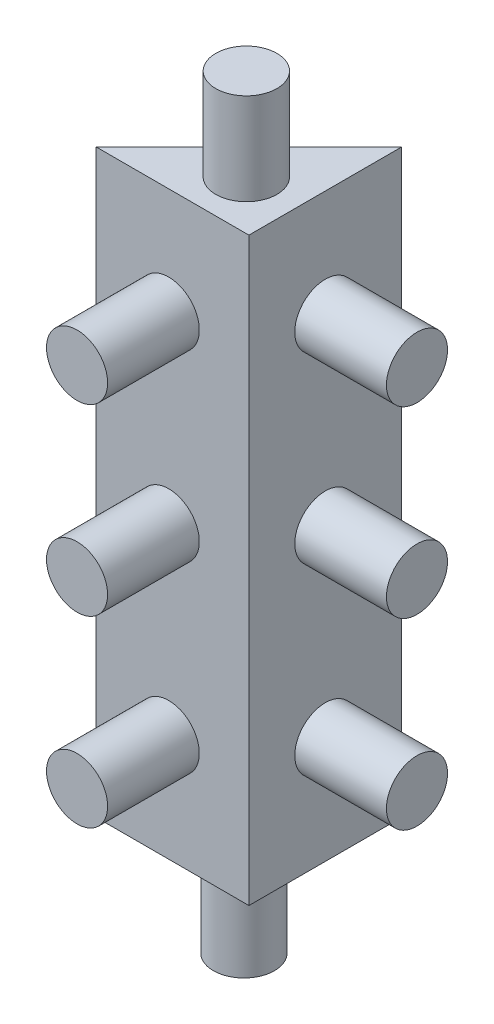
ISO-10303-21;
HEADER;
FILE_DESCRIPTION(('STEP AP214'),'2;1');
FILE_NAME('part.step','',(''),(''),'','','');
FILE_SCHEMA(('AUTOMOTIVE_DESIGN { 1 0 10303 214 1 1 1 1 }'));
ENDSEC;
DATA;
#1=APPLICATION_CONTEXT('core data for automotive mechanical design processes');
#2=APPLICATION_PROTOCOL_DEFINITION('international standard','automotive_design',2000,#1);
#3=PRODUCT_CONTEXT('',#1,'mechanical');
#4=PRODUCT('Part','Part','',(#3));
#5=PRODUCT_RELATED_PRODUCT_CATEGORY('part','',(#4));
#6=PRODUCT_DEFINITION_FORMATION('','',#4);
#7=PRODUCT_DEFINITION_CONTEXT('part definition',#1,'design');
#8=PRODUCT_DEFINITION('design','',#6,#7);
#9=PRODUCT_DEFINITION_SHAPE('','',#8);
#10=(LENGTH_UNIT() NAMED_UNIT(*) SI_UNIT(.MILLI.,.METRE.));
#11=(NAMED_UNIT(*) PLANE_ANGLE_UNIT() SI_UNIT($,.RADIAN.));
#12=(NAMED_UNIT(*) SI_UNIT($,.STERADIAN.) SOLID_ANGLE_UNIT());
#13=UNCERTAINTY_MEASURE_WITH_UNIT(LENGTH_MEASURE(1.E-05),#10,'distance_accuracy_value','');
#14=(GEOMETRIC_REPRESENTATION_CONTEXT(3) GLOBAL_UNCERTAINTY_ASSIGNED_CONTEXT((#13)) GLOBAL_UNIT_ASSIGNED_CONTEXT((#10,
#11,#12)) REPRESENTATION_CONTEXT('',''));
#15=CARTESIAN_POINT('',(0.,0.,0.));
#16=DIRECTION('',(0.,0.,1.));
#17=DIRECTION('',(1.,0.,0.));
#18=AXIS2_PLACEMENT_3D('',#15,#16,#17);
#19=CARTESIAN_POINT('',(6.66438695565709,48.26,-6.66438695565709));
#20=DIRECTION('',(-1.,0.,0.));
#21=DIRECTION('',(0.,0.,1.));
#22=AXIS2_PLACEMENT_3D('',#19,#20,#21);
#23=PLANE('',#22);
#24=CARTESIAN_POINT('',(6.66438695565709,39.37,-0.314386955657094));
#25=DIRECTION('',(-1.,0.,0.));
#26=DIRECTION('',(0.,0.,1.));
#27=AXIS2_PLACEMENT_3D('',#24,#25,#26);
#28=CIRCLE('',#27,2.54);
#29=CARTESIAN_POINT('',(6.66438695565709,39.37,2.22561304434291));
#30=VERTEX_POINT('',#29);
#31=EDGE_CURVE('E40',#30,#30,#28,.F.);
#32=ORIENTED_EDGE('',*,*,#31,.F.);
#33=EDGE_LOOP('',(#32));
#34=FACE_BOUND('',#33,.T.);
#35=CARTESIAN_POINT('',(6.66438695565709,24.13,-0.314386955657094));
#36=DIRECTION('',(-1.,0.,0.));
#37=DIRECTION('',(0.,0.,1.));
#38=AXIS2_PLACEMENT_3D('',#35,#36,#37);
#39=CIRCLE('',#38,2.54);
#40=CARTESIAN_POINT('',(6.66438695565709,24.13,2.22561304434291));
#41=VERTEX_POINT('',#40);
#42=EDGE_CURVE('E100',#41,#41,#39,.F.);
#43=ORIENTED_EDGE('',*,*,#42,.F.);
#44=EDGE_LOOP('',(#43));
#45=FACE_BOUND('',#44,.T.);
#46=CARTESIAN_POINT('',(6.66438695565709,8.89,-0.314386955657094));
#47=DIRECTION('',(-1.,0.,0.));
#48=DIRECTION('',(0.,0.,1.));
#49=AXIS2_PLACEMENT_3D('',#46,#47,#48);
#50=CIRCLE('',#49,2.54);
#51=CARTESIAN_POINT('',(6.66438695565709,8.89,2.22561304434291));
#52=VERTEX_POINT('',#51);
#53=EDGE_CURVE('E97',#52,#52,#50,.F.);
#54=ORIENTED_EDGE('',*,*,#53,.F.);
#55=EDGE_LOOP('',(#54));
#56=FACE_BOUND('',#55,.T.);
#57=DIRECTION('',(0.,0.,-1.));
#58=VECTOR('',#57,1.);
#59=CARTESIAN_POINT('',(6.66438695565709,0.,-6.66438695565709));
#60=LINE('',#59,#58);
#61=CARTESIAN_POINT('',(6.66438695565709,0.,6.03561304434291));
#62=VERTEX_POINT('',#61);
#63=CARTESIAN_POINT('',(6.66438695565709,0.,-6.66438695565709));
#64=VERTEX_POINT('',#63);
#65=EDGE_CURVE('E82',#62,#64,#60,.T.);
#66=ORIENTED_EDGE('',*,*,#65,.T.);
#67=DIRECTION('',(0.,-1.,0.));
#68=VECTOR('',#67,1.);
#69=CARTESIAN_POINT('',(6.66438695565709,48.26,-6.66438695565709));
#70=LINE('',#69,#68);
#71=CARTESIAN_POINT('',(6.66438695565709,48.26,-6.66438695565709));
#72=VERTEX_POINT('',#71);
#73=EDGE_CURVE('E72',#72,#64,#70,.T.);
#74=ORIENTED_EDGE('',*,*,#73,.F.);
#75=DIRECTION('',(0.,0.,-1.));
#76=VECTOR('',#75,1.);
#77=CARTESIAN_POINT('',(6.66438695565709,48.26,-6.66438695565709));
#78=LINE('',#77,#76);
#79=CARTESIAN_POINT('',(6.66438695565709,48.26,6.03561304434291));
#80=VERTEX_POINT('',#79);
#81=EDGE_CURVE('E75',#80,#72,#78,.T.);
#82=ORIENTED_EDGE('',*,*,#81,.F.);
#83=DIRECTION('',(0.,-1.,0.));
#84=VECTOR('',#83,1.);
#85=CARTESIAN_POINT('',(6.66438695565709,48.26,6.03561304434291));
#86=LINE('',#85,#84);
#87=EDGE_CURVE('E88',#80,#62,#86,.T.);
#88=ORIENTED_EDGE('',*,*,#87,.T.);
#89=EDGE_LOOP('',(#66,#74,#82,#88));
#90=FACE_BOUND('',#89,.T.);
#91=ADVANCED_FACE('F32',(#34,#45,#56,#90),#23,.F.);
#92=CARTESIAN_POINT('',(-6.03561304434291,48.26,6.03561304434291));
#93=DIRECTION('',(0.707106781186548,0.,0.707106781186547));
#94=DIRECTION('',(0.707106781186547,0.,-0.707106781186548));
#95=AXIS2_PLACEMENT_3D('',#92,#93,#94);
#96=PLANE('',#95);
#97=DIRECTION('',(-0.707106781186547,0.,0.707106781186548));
#98=VECTOR('',#97,1.);
#99=CARTESIAN_POINT('',(-6.03561304434291,0.,6.03561304434291));
#100=LINE('',#99,#98);
#101=CARTESIAN_POINT('',(-6.03561304434291,0.,6.03561304434291));
#102=VERTEX_POINT('',#101);
#103=EDGE_CURVE('E61',#64,#102,#100,.T.);
#104=ORIENTED_EDGE('',*,*,#103,.T.);
#105=DIRECTION('',(0.,-1.,0.));
#106=VECTOR('',#105,1.);
#107=CARTESIAN_POINT('',(-6.03561304434291,48.26,6.03561304434291));
#108=LINE('',#107,#106);
#109=CARTESIAN_POINT('',(-6.03561304434291,48.26,6.03561304434291));
#110=VERTEX_POINT('',#109);
#111=EDGE_CURVE('E74',#110,#102,#108,.T.);
#112=ORIENTED_EDGE('',*,*,#111,.F.);
#113=DIRECTION('',(-0.707106781186547,0.,0.707106781186548));
#114=VECTOR('',#113,1.);
#115=CARTESIAN_POINT('',(-6.03561304434291,48.26,6.03561304434291));
#116=LINE('',#115,#114);
#117=EDGE_CURVE('E69',#72,#110,#116,.T.);
#118=ORIENTED_EDGE('',*,*,#117,.F.);
#119=ORIENTED_EDGE('',*,*,#73,.T.);
#120=EDGE_LOOP('',(#104,#112,#118,#119));
#121=FACE_BOUND('',#120,.T.);
#122=ADVANCED_FACE('F70',(#121),#96,.F.);
#123=CARTESIAN_POINT('',(-6.03561304434291,48.26,6.03561304434291));
#124=DIRECTION('',(0.,0.,-1.));
#125=DIRECTION('',(-1.,0.,0.));
#126=AXIS2_PLACEMENT_3D('',#123,#124,#125);
#127=PLANE('',#126);
#128=CARTESIAN_POINT('',(0.,39.37,6.03561304434291));
#129=DIRECTION('',(0.,0.,-1.));
#130=DIRECTION('',(-1.,0.,0.));
#131=AXIS2_PLACEMENT_3D('',#128,#129,#130);
#132=CIRCLE('',#131,2.54);
#133=CARTESIAN_POINT('',(-2.54,39.37,6.03561304434291));
#134=VERTEX_POINT('',#133);
#135=EDGE_CURVE('E94',#134,#134,#132,.F.);
#136=ORIENTED_EDGE('',*,*,#135,.F.);
#137=EDGE_LOOP('',(#136));
#138=FACE_BOUND('',#137,.T.);
#139=CARTESIAN_POINT('',(0.,24.13,6.03561304434291));
#140=DIRECTION('',(0.,0.,-1.));
#141=DIRECTION('',(-1.,0.,0.));
#142=AXIS2_PLACEMENT_3D('',#139,#140,#141);
#143=CIRCLE('',#142,2.54);
#144=CARTESIAN_POINT('',(-2.54,24.13,6.03561304434291));
#145=VERTEX_POINT('',#144);
#146=EDGE_CURVE('E86',#145,#145,#143,.F.);
#147=ORIENTED_EDGE('',*,*,#146,.F.);
#148=EDGE_LOOP('',(#147));
#149=FACE_BOUND('',#148,.T.);
#150=CARTESIAN_POINT('',(0.,8.89,6.03561304434291));
#151=DIRECTION('',(0.,0.,-1.));
#152=DIRECTION('',(-1.,0.,0.));
#153=AXIS2_PLACEMENT_3D('',#150,#151,#152);
#154=CIRCLE('',#153,2.54);
#155=CARTESIAN_POINT('',(-2.54,8.89,6.03561304434291));
#156=VERTEX_POINT('',#155);
#157=EDGE_CURVE('E83',#156,#156,#154,.F.);
#158=ORIENTED_EDGE('',*,*,#157,.F.);
#159=EDGE_LOOP('',(#158));
#160=FACE_BOUND('',#159,.T.);
#161=DIRECTION('',(1.,0.,0.));
#162=VECTOR('',#161,1.);
#163=CARTESIAN_POINT('',(-6.03561304434291,0.,6.03561304434291));
#164=LINE('',#163,#162);
#165=EDGE_CURVE('E66',#102,#62,#164,.T.);
#166=ORIENTED_EDGE('',*,*,#165,.T.);
#167=ORIENTED_EDGE('',*,*,#87,.F.);
#168=DIRECTION('',(1.,0.,0.));
#169=VECTOR('',#168,1.);
#170=CARTESIAN_POINT('',(-6.03561304434291,48.26,6.03561304434291));
#171=LINE('',#170,#169);
#172=EDGE_CURVE('E48',#110,#80,#171,.T.);
#173=ORIENTED_EDGE('',*,*,#172,.F.);
#174=ORIENTED_EDGE('',*,*,#111,.T.);
#175=EDGE_LOOP('',(#166,#167,#173,#174));
#176=FACE_BOUND('',#175,.T.);
#177=ADVANCED_FACE('F154',(#138,#149,#160,#176),#127,.F.);
#178=CARTESIAN_POINT('',(0.,48.26,0.));
#179=DIRECTION('',(0.,1.,0.));
#180=DIRECTION('',(0.,0.,1.));
#181=AXIS2_PLACEMENT_3D('',#178,#179,#180);
#182=PLANE('',#181);
#183=CARTESIAN_POINT('',(2.36043583447517,48.26,1.94481378475693));
#184=DIRECTION('',(0.,1.,0.));
#185=DIRECTION('',(0.,0.,1.));
#186=AXIS2_PLACEMENT_3D('',#183,#184,#185);
#187=CIRCLE('',#186,2.54);
#188=CARTESIAN_POINT('',(2.36043583447517,48.26,4.48481378475693));
#189=VERTEX_POINT('',#188);
#190=EDGE_CURVE('E301',#189,#189,#187,.T.);
#191=ORIENTED_EDGE('',*,*,#190,.F.);
#192=EDGE_LOOP('',(#191));
#193=FACE_BOUND('',#192,.T.);
#194=ORIENTED_EDGE('',*,*,#81,.T.);
#195=ORIENTED_EDGE('',*,*,#117,.T.);
#196=ORIENTED_EDGE('',*,*,#172,.T.);
#197=EDGE_LOOP('',(#194,#195,#196));
#198=FACE_BOUND('',#197,.T.);
#199=ADVANCED_FACE('F78',(#193,#198),#182,.T.);
#200=CARTESIAN_POINT('',(0.,0.,0.));
#201=DIRECTION('',(0.,1.,0.));
#202=DIRECTION('',(0.,0.,1.));
#203=AXIS2_PLACEMENT_3D('',#200,#201,#202);
#204=PLANE('',#203);
#205=CARTESIAN_POINT('',(2.25920074041402,0.,2.04604887881808));
#206=DIRECTION('',(0.,1.,0.));
#207=DIRECTION('',(0.,0.,1.));
#208=AXIS2_PLACEMENT_3D('',#205,#206,#207);
#209=CIRCLE('',#208,2.54);
#210=CARTESIAN_POINT('',(2.25920074041402,0.,4.58604887881808));
#211=VERTEX_POINT('',#210);
#212=EDGE_CURVE('E11',#211,#211,#209,.F.);
#213=ORIENTED_EDGE('',*,*,#212,.F.);
#214=EDGE_LOOP('',(#213));
#215=FACE_BOUND('',#214,.T.);
#216=ORIENTED_EDGE('',*,*,#65,.F.);
#217=ORIENTED_EDGE('',*,*,#165,.F.);
#218=ORIENTED_EDGE('',*,*,#103,.F.);
#219=EDGE_LOOP('',(#216,#217,#218));
#220=FACE_BOUND('',#219,.T.);
#221=ADVANCED_FACE('F150',(#215,#220),#204,.F.);
#222=CARTESIAN_POINT('',(0.,8.89,13.6556130443429));
#223=DIRECTION('',(0.,0.,-1.));
#224=DIRECTION('',(-1.,0.,0.));
#225=AXIS2_PLACEMENT_3D('',#222,#223,#224);
#226=CYLINDRICAL_SURFACE('',#225,2.54);
#227=CARTESIAN_POINT('',(0.,8.89,13.6556130443429));
#228=DIRECTION('',(0.,0.,1.));
#229=DIRECTION('',(1.,0.,0.));
#230=AXIS2_PLACEMENT_3D('',#227,#228,#229);
#231=CIRCLE('',#230,2.54);
#232=CARTESIAN_POINT('',(-2.54,8.89,13.6556130443429));
#233=VERTEX_POINT('',#232);
#234=EDGE_CURVE('E323',#233,#233,#231,.T.);
#235=CARTESIAN_POINT('',(-2.54,8.89,13.6556130443429));
#236=CARTESIAN_POINT('',(-2.54,8.89,13.5762380443429));
#237=CARTESIAN_POINT('',(-2.54,8.89,13.4968630443429));
#238=CARTESIAN_POINT('',(-2.54,8.89,13.3381130443429));
#239=CARTESIAN_POINT('',(-2.54,8.89,13.2587380443429));
#240=CARTESIAN_POINT('',(-2.54,8.89,13.0999880443429));
#241=CARTESIAN_POINT('',(-2.54,8.89,13.0206130443429));
#242=CARTESIAN_POINT('',(-2.54,8.89,12.8618630443429));
#243=CARTESIAN_POINT('',(-2.54,8.89,12.7824880443429));
#244=CARTESIAN_POINT('',(-2.54,8.89,12.6237380443429));
#245=CARTESIAN_POINT('',(-2.54,8.89,12.5443630443429));
#246=CARTESIAN_POINT('',(-2.54,8.89,12.3856130443429));
#247=CARTESIAN_POINT('',(-2.54,8.89,12.3062380443429));
#248=CARTESIAN_POINT('',(-2.54,8.89,12.1474880443429));
#249=CARTESIAN_POINT('',(-2.54,8.89,12.0681130443429));
#250=CARTESIAN_POINT('',(-2.54,8.89,11.9093630443429));
#251=CARTESIAN_POINT('',(-2.54,8.89,11.8299880443429));
#252=CARTESIAN_POINT('',(-2.54,8.89,11.6712380443429));
#253=CARTESIAN_POINT('',(-2.54,8.89,11.5918630443429));
#254=CARTESIAN_POINT('',(-2.54,8.89,11.4331130443429));
#255=CARTESIAN_POINT('',(-2.54,8.89,11.3537380443429));
#256=CARTESIAN_POINT('',(-2.54,8.89,11.1949880443429));
#257=CARTESIAN_POINT('',(-2.54,8.89,11.1156130443429));
#258=CARTESIAN_POINT('',(-2.54,8.89,10.9568630443429));
#259=CARTESIAN_POINT('',(-2.54,8.89,10.8774880443429));
#260=CARTESIAN_POINT('',(-2.54,8.89,10.7187380443429));
#261=CARTESIAN_POINT('',(-2.54,8.89,10.6393630443429));
#262=CARTESIAN_POINT('',(-2.54,8.89,10.4806130443429));
#263=CARTESIAN_POINT('',(-2.54,8.89,10.4012380443429));
#264=CARTESIAN_POINT('',(-2.54,8.89,10.2424880443429));
#265=CARTESIAN_POINT('',(-2.54,8.89,10.1631130443429));
#266=CARTESIAN_POINT('',(-2.54,8.89,10.0043630443429));
#267=CARTESIAN_POINT('',(-2.54,8.89,9.9249880443429));
#268=CARTESIAN_POINT('',(-2.54,8.89,9.7662380443429));
#269=CARTESIAN_POINT('',(-2.54,8.89,9.68686304434291));
#270=CARTESIAN_POINT('',(-2.54,8.89,9.52811304434291));
#271=CARTESIAN_POINT('',(-2.54,8.89,9.44873804434291));
#272=CARTESIAN_POINT('',(-2.54,8.89,9.28998804434291));
#273=CARTESIAN_POINT('',(-2.54,8.89,9.2106130443429));
#274=CARTESIAN_POINT('',(-2.54,8.89,9.05186304434291));
#275=CARTESIAN_POINT('',(-2.54,8.89,8.9724880443429));
#276=CARTESIAN_POINT('',(-2.54,8.89,8.81373804434291));
#277=CARTESIAN_POINT('',(-2.54,8.89,8.7343630443429));
#278=CARTESIAN_POINT('',(-2.54,8.89,8.57561304434291));
#279=CARTESIAN_POINT('',(-2.54,8.89,8.4962380443429));
#280=CARTESIAN_POINT('',(-2.54,8.89,8.3374880443429));
#281=CARTESIAN_POINT('',(-2.54,8.89,8.25811304434291));
#282=CARTESIAN_POINT('',(-2.54,8.89,8.09936304434291));
#283=CARTESIAN_POINT('',(-2.54,8.89,8.0199880443429));
#284=CARTESIAN_POINT('',(-2.54,8.89,7.86123804434291));
#285=CARTESIAN_POINT('',(-2.54,8.89,7.7818630443429));
#286=CARTESIAN_POINT('',(-2.54,8.89,7.62311304434291));
#287=CARTESIAN_POINT('',(-2.54,8.89,7.54373804434291));
#288=CARTESIAN_POINT('',(-2.54,8.89,7.38498804434291));
#289=CARTESIAN_POINT('',(-2.54,8.89,7.30561304434291));
#290=CARTESIAN_POINT('',(-2.54,8.89,7.14686304434291));
#291=CARTESIAN_POINT('',(-2.54,8.89,7.06748804434291));
#292=CARTESIAN_POINT('',(-2.54,8.89,6.90873804434291));
#293=CARTESIAN_POINT('',(-2.54,8.89,6.82936304434291));
#294=CARTESIAN_POINT('',(-2.54,8.89,6.67061304434291));
#295=CARTESIAN_POINT('',(-2.54,8.89,6.59123804434291));
#296=CARTESIAN_POINT('',(-2.54,8.89,6.43248804434291));
#297=CARTESIAN_POINT('',(-2.54,8.89,6.35311304434291));
#298=CARTESIAN_POINT('',(-2.54,8.89,6.19436304434291));
#299=CARTESIAN_POINT('',(-2.54,8.89,6.11498804434291));
#300=CARTESIAN_POINT('',(-2.54,8.89,6.03561304434291));
#301=B_SPLINE_CURVE_WITH_KNOTS('',3,(#235,#236,#237,#238,#239,#240,#241,#242,#243,#244,#245,
#246,#247,#248,#249,#250,#251,#252,#253,#254,#255,#256,#257,#258,#259,#260,#261,#262,#263,#264,
#265,#266,#267,#268,#269,#270,#271,#272,#273,#274,#275,#276,#277,#278,#279,#280,#281,#282,#283,
#284,#285,#286,#287,#288,#289,#290,#291,#292,#293,#294,#295,#296,#297,#298,#299,#300),
.UNSPECIFIED.,.F.,.F.,(4,2,2,2,2,2,2,2,2,2,2,2,2,2,2,2,2,2,2,2,2,2,2,2,2,2,2,2,2,2,2,2,4),(0.,
0.238125,0.476250000000001,0.714375000000001,0.9525,1.190625,1.42875,1.666875,1.905,2.143125,
2.38125,2.619375,2.8575,3.095625,3.33375,3.571875,3.81,4.048125,4.28625,4.524375,4.7625,
5.000625,5.23875,5.476875,5.715,5.953125,6.19125,6.429375,6.6675,6.905625,7.14375,7.381875,
7.62),.UNSPECIFIED.);
#302=EDGE_CURVE('BSEAM146',#233,#156,#301,.T.);
#303=ORIENTED_EDGE('',*,*,#234,.F.);
#304=ORIENTED_EDGE('',*,*,#157,.T.);
#305=ORIENTED_EDGE('',*,*,#302,.T.);
#306=ORIENTED_EDGE('',*,*,#302,.F.);
#307=EDGE_LOOP('',(#303,#305,#304,#306));
#308=FACE_BOUND('',#307,.T.);
#309=ADVANCED_FACE('F146',(#308),#226,.T.);
#310=CARTESIAN_POINT('',(0.,8.89,13.6556130443429));
#311=DIRECTION('',(0.,0.,1.));
#312=DIRECTION('',(1.,0.,0.));
#313=AXIS2_PLACEMENT_3D('',#310,#311,#312);
#314=PLANE('',#313);
#315=ORIENTED_EDGE('',*,*,#234,.T.);
#316=EDGE_LOOP('',(#315));
#317=FACE_BOUND('',#316,.T.);
#318=ADVANCED_FACE('F142',(#317),#314,.T.);
#319=CARTESIAN_POINT('',(0.,24.13,13.6556130443429));
#320=DIRECTION('',(0.,0.,-1.));
#321=DIRECTION('',(-1.,0.,0.));
#322=AXIS2_PLACEMENT_3D('',#319,#320,#321);
#323=CYLINDRICAL_SURFACE('',#322,2.54);
#324=CARTESIAN_POINT('',(0.,24.13,13.6556130443429));
#325=DIRECTION('',(0.,0.,1.));
#326=DIRECTION('',(1.,0.,0.));
#327=AXIS2_PLACEMENT_3D('',#324,#325,#326);
#328=CIRCLE('',#327,2.54);
#329=CARTESIAN_POINT('',(-2.54,24.13,13.6556130443429));
#330=VERTEX_POINT('',#329);
#331=EDGE_CURVE('E320',#330,#330,#328,.T.);
#332=CARTESIAN_POINT('',(-2.54,24.13,13.6556130443429));
#333=CARTESIAN_POINT('',(-2.54,24.13,13.5762380443429));
#334=CARTESIAN_POINT('',(-2.54,24.13,13.4968630443429));
#335=CARTESIAN_POINT('',(-2.54,24.13,13.3381130443429));
#336=CARTESIAN_POINT('',(-2.54,24.13,13.2587380443429));
#337=CARTESIAN_POINT('',(-2.54,24.13,13.0999880443429));
#338=CARTESIAN_POINT('',(-2.54,24.13,13.0206130443429));
#339=CARTESIAN_POINT('',(-2.54,24.13,12.8618630443429));
#340=CARTESIAN_POINT('',(-2.54,24.13,12.7824880443429));
#341=CARTESIAN_POINT('',(-2.54,24.13,12.6237380443429));
#342=CARTESIAN_POINT('',(-2.54,24.13,12.5443630443429));
#343=CARTESIAN_POINT('',(-2.54,24.13,12.3856130443429));
#344=CARTESIAN_POINT('',(-2.54,24.13,12.3062380443429));
#345=CARTESIAN_POINT('',(-2.54,24.13,12.1474880443429));
#346=CARTESIAN_POINT('',(-2.54,24.13,12.0681130443429));
#347=CARTESIAN_POINT('',(-2.54,24.13,11.9093630443429));
#348=CARTESIAN_POINT('',(-2.54,24.13,11.8299880443429));
#349=CARTESIAN_POINT('',(-2.54,24.13,11.6712380443429));
#350=CARTESIAN_POINT('',(-2.54,24.13,11.5918630443429));
#351=CARTESIAN_POINT('',(-2.54,24.13,11.4331130443429));
#352=CARTESIAN_POINT('',(-2.54,24.13,11.3537380443429));
#353=CARTESIAN_POINT('',(-2.54,24.13,11.1949880443429));
#354=CARTESIAN_POINT('',(-2.54,24.13,11.1156130443429));
#355=CARTESIAN_POINT('',(-2.54,24.13,10.9568630443429));
#356=CARTESIAN_POINT('',(-2.54,24.13,10.8774880443429));
#357=CARTESIAN_POINT('',(-2.54,24.13,10.7187380443429));
#358=CARTESIAN_POINT('',(-2.54,24.13,10.6393630443429));
#359=CARTESIAN_POINT('',(-2.54,24.13,10.4806130443429));
#360=CARTESIAN_POINT('',(-2.54,24.13,10.4012380443429));
#361=CARTESIAN_POINT('',(-2.54,24.13,10.2424880443429));
#362=CARTESIAN_POINT('',(-2.54,24.13,10.1631130443429));
#363=CARTESIAN_POINT('',(-2.54,24.13,10.0043630443429));
#364=CARTESIAN_POINT('',(-2.54,24.13,9.9249880443429));
#365=CARTESIAN_POINT('',(-2.54,24.13,9.7662380443429));
#366=CARTESIAN_POINT('',(-2.54,24.13,9.68686304434291));
#367=CARTESIAN_POINT('',(-2.54,24.13,9.52811304434291));
#368=CARTESIAN_POINT('',(-2.54,24.13,9.44873804434291));
#369=CARTESIAN_POINT('',(-2.54,24.13,9.28998804434291));
#370=CARTESIAN_POINT('',(-2.54,24.13,9.2106130443429));
#371=CARTESIAN_POINT('',(-2.54,24.13,9.05186304434291));
#372=CARTESIAN_POINT('',(-2.54,24.13,8.9724880443429));
#373=CARTESIAN_POINT('',(-2.54,24.13,8.81373804434291));
#374=CARTESIAN_POINT('',(-2.54,24.13,8.7343630443429));
#375=CARTESIAN_POINT('',(-2.54,24.13,8.57561304434291));
#376=CARTESIAN_POINT('',(-2.54,24.13,8.4962380443429));
#377=CARTESIAN_POINT('',(-2.54,24.13,8.3374880443429));
#378=CARTESIAN_POINT('',(-2.54,24.13,8.25811304434291));
#379=CARTESIAN_POINT('',(-2.54,24.13,8.09936304434291));
#380=CARTESIAN_POINT('',(-2.54,24.13,8.0199880443429));
#381=CARTESIAN_POINT('',(-2.54,24.13,7.86123804434291));
#382=CARTESIAN_POINT('',(-2.54,24.13,7.7818630443429));
#383=CARTESIAN_POINT('',(-2.54,24.13,7.62311304434291));
#384=CARTESIAN_POINT('',(-2.54,24.13,7.54373804434291));
#385=CARTESIAN_POINT('',(-2.54,24.13,7.38498804434291));
#386=CARTESIAN_POINT('',(-2.54,24.13,7.30561304434291));
#387=CARTESIAN_POINT('',(-2.54,24.13,7.14686304434291));
#388=CARTESIAN_POINT('',(-2.54,24.13,7.06748804434291));
#389=CARTESIAN_POINT('',(-2.54,24.13,6.90873804434291));
#390=CARTESIAN_POINT('',(-2.54,24.13,6.82936304434291));
#391=CARTESIAN_POINT('',(-2.54,24.13,6.67061304434291));
#392=CARTESIAN_POINT('',(-2.54,24.13,6.59123804434291));
#393=CARTESIAN_POINT('',(-2.54,24.13,6.43248804434291));
#394=CARTESIAN_POINT('',(-2.54,24.13,6.35311304434291));
#395=CARTESIAN_POINT('',(-2.54,24.13,6.19436304434291));
#396=CARTESIAN_POINT('',(-2.54,24.13,6.11498804434291));
#397=CARTESIAN_POINT('',(-2.54,24.13,6.03561304434291));
#398=B_SPLINE_CURVE_WITH_KNOTS('',3,(#332,#333,#334,#335,#336,#337,#338,#339,#340,#341,#342,
#343,#344,#345,#346,#347,#348,#349,#350,#351,#352,#353,#354,#355,#356,#357,#358,#359,#360,#361,
#362,#363,#364,#365,#366,#367,#368,#369,#370,#371,#372,#373,#374,#375,#376,#377,#378,#379,#380,
#381,#382,#383,#384,#385,#386,#387,#388,#389,#390,#391,#392,#393,#394,#395,#396,#397),
.UNSPECIFIED.,.F.,.F.,(4,2,2,2,2,2,2,2,2,2,2,2,2,2,2,2,2,2,2,2,2,2,2,2,2,2,2,2,2,2,2,2,4),(0.,
0.238125,0.476250000000001,0.714375000000001,0.9525,1.190625,1.42875,1.666875,1.905,2.143125,
2.38125,2.619375,2.8575,3.095625,3.33375,3.571875,3.81,4.048125,4.28625,4.524375,4.7625,
5.000625,5.23875,5.476875,5.715,5.953125,6.19125,6.429375,6.6675,6.905625,7.14375,7.381875,
7.62),.UNSPECIFIED.);
#399=EDGE_CURVE('BSEAM138',#330,#145,#398,.T.);
#400=ORIENTED_EDGE('',*,*,#331,.F.);
#401=ORIENTED_EDGE('',*,*,#146,.T.);
#402=ORIENTED_EDGE('',*,*,#399,.T.);
#403=ORIENTED_EDGE('',*,*,#399,.F.);
#404=EDGE_LOOP('',(#400,#402,#401,#403));
#405=FACE_BOUND('',#404,.T.);
#406=ADVANCED_FACE('F138',(#405),#323,.T.);
#407=CARTESIAN_POINT('',(0.,24.13,13.6556130443429));
#408=DIRECTION('',(0.,0.,1.));
#409=DIRECTION('',(1.,0.,0.));
#410=AXIS2_PLACEMENT_3D('',#407,#408,#409);
#411=PLANE('',#410);
#412=ORIENTED_EDGE('',*,*,#331,.T.);
#413=EDGE_LOOP('',(#412));
#414=FACE_BOUND('',#413,.T.);
#415=ADVANCED_FACE('F134',(#414),#411,.T.);
#416=CARTESIAN_POINT('',(0.,39.37,13.6556130443429));
#417=DIRECTION('',(0.,0.,-1.));
#418=DIRECTION('',(-1.,0.,0.));
#419=AXIS2_PLACEMENT_3D('',#416,#417,#418);
#420=CYLINDRICAL_SURFACE('',#419,2.54);
#421=CARTESIAN_POINT('',(0.,39.37,13.6556130443429));
#422=DIRECTION('',(0.,0.,1.));
#423=DIRECTION('',(1.,0.,0.));
#424=AXIS2_PLACEMENT_3D('',#421,#422,#423);
#425=CIRCLE('',#424,2.54);
#426=CARTESIAN_POINT('',(-2.54,39.37,13.6556130443429));
#427=VERTEX_POINT('',#426);
#428=EDGE_CURVE('E317',#427,#427,#425,.T.);
#429=CARTESIAN_POINT('',(-2.54,39.37,13.6556130443429));
#430=CARTESIAN_POINT('',(-2.54,39.37,13.5762380443429));
#431=CARTESIAN_POINT('',(-2.54,39.37,13.4968630443429));
#432=CARTESIAN_POINT('',(-2.54,39.37,13.3381130443429));
#433=CARTESIAN_POINT('',(-2.54,39.37,13.2587380443429));
#434=CARTESIAN_POINT('',(-2.54,39.37,13.0999880443429));
#435=CARTESIAN_POINT('',(-2.54,39.37,13.0206130443429));
#436=CARTESIAN_POINT('',(-2.54,39.37,12.8618630443429));
#437=CARTESIAN_POINT('',(-2.54,39.37,12.7824880443429));
#438=CARTESIAN_POINT('',(-2.54,39.37,12.6237380443429));
#439=CARTESIAN_POINT('',(-2.54,39.37,12.5443630443429));
#440=CARTESIAN_POINT('',(-2.54,39.37,12.3856130443429));
#441=CARTESIAN_POINT('',(-2.54,39.37,12.3062380443429));
#442=CARTESIAN_POINT('',(-2.54,39.37,12.1474880443429));
#443=CARTESIAN_POINT('',(-2.54,39.37,12.0681130443429));
#444=CARTESIAN_POINT('',(-2.54,39.37,11.9093630443429));
#445=CARTESIAN_POINT('',(-2.54,39.37,11.8299880443429));
#446=CARTESIAN_POINT('',(-2.54,39.37,11.6712380443429));
#447=CARTESIAN_POINT('',(-2.54,39.37,11.5918630443429));
#448=CARTESIAN_POINT('',(-2.54,39.37,11.4331130443429));
#449=CARTESIAN_POINT('',(-2.54,39.37,11.3537380443429));
#450=CARTESIAN_POINT('',(-2.54,39.37,11.1949880443429));
#451=CARTESIAN_POINT('',(-2.54,39.37,11.1156130443429));
#452=CARTESIAN_POINT('',(-2.54,39.37,10.9568630443429));
#453=CARTESIAN_POINT('',(-2.54,39.37,10.8774880443429));
#454=CARTESIAN_POINT('',(-2.54,39.37,10.7187380443429));
#455=CARTESIAN_POINT('',(-2.54,39.37,10.6393630443429));
#456=CARTESIAN_POINT('',(-2.54,39.37,10.4806130443429));
#457=CARTESIAN_POINT('',(-2.54,39.37,10.4012380443429));
#458=CARTESIAN_POINT('',(-2.54,39.37,10.2424880443429));
#459=CARTESIAN_POINT('',(-2.54,39.37,10.1631130443429));
#460=CARTESIAN_POINT('',(-2.54,39.37,10.0043630443429));
#461=CARTESIAN_POINT('',(-2.54,39.37,9.9249880443429));
#462=CARTESIAN_POINT('',(-2.54,39.37,9.7662380443429));
#463=CARTESIAN_POINT('',(-2.54,39.37,9.68686304434291));
#464=CARTESIAN_POINT('',(-2.54,39.37,9.52811304434291));
#465=CARTESIAN_POINT('',(-2.54,39.37,9.44873804434291));
#466=CARTESIAN_POINT('',(-2.54,39.37,9.28998804434291));
#467=CARTESIAN_POINT('',(-2.54,39.37,9.2106130443429));
#468=CARTESIAN_POINT('',(-2.54,39.37,9.05186304434291));
#469=CARTESIAN_POINT('',(-2.54,39.37,8.9724880443429));
#470=CARTESIAN_POINT('',(-2.54,39.37,8.81373804434291));
#471=CARTESIAN_POINT('',(-2.54,39.37,8.7343630443429));
#472=CARTESIAN_POINT('',(-2.54,39.37,8.57561304434291));
#473=CARTESIAN_POINT('',(-2.54,39.37,8.4962380443429));
#474=CARTESIAN_POINT('',(-2.54,39.37,8.3374880443429));
#475=CARTESIAN_POINT('',(-2.54,39.37,8.25811304434291));
#476=CARTESIAN_POINT('',(-2.54,39.37,8.09936304434291));
#477=CARTESIAN_POINT('',(-2.54,39.37,8.0199880443429));
#478=CARTESIAN_POINT('',(-2.54,39.37,7.86123804434291));
#479=CARTESIAN_POINT('',(-2.54,39.37,7.7818630443429));
#480=CARTESIAN_POINT('',(-2.54,39.37,7.62311304434291));
#481=CARTESIAN_POINT('',(-2.54,39.37,7.54373804434291));
#482=CARTESIAN_POINT('',(-2.54,39.37,7.38498804434291));
#483=CARTESIAN_POINT('',(-2.54,39.37,7.30561304434291));
#484=CARTESIAN_POINT('',(-2.54,39.37,7.14686304434291));
#485=CARTESIAN_POINT('',(-2.54,39.37,7.06748804434291));
#486=CARTESIAN_POINT('',(-2.54,39.37,6.90873804434291));
#487=CARTESIAN_POINT('',(-2.54,39.37,6.82936304434291));
#488=CARTESIAN_POINT('',(-2.54,39.37,6.67061304434291));
#489=CARTESIAN_POINT('',(-2.54,39.37,6.59123804434291));
#490=CARTESIAN_POINT('',(-2.54,39.37,6.43248804434291));
#491=CARTESIAN_POINT('',(-2.54,39.37,6.35311304434291));
#492=CARTESIAN_POINT('',(-2.54,39.37,6.19436304434291));
#493=CARTESIAN_POINT('',(-2.54,39.37,6.11498804434291));
#494=CARTESIAN_POINT('',(-2.54,39.37,6.03561304434291));
#495=B_SPLINE_CURVE_WITH_KNOTS('',3,(#429,#430,#431,#432,#433,#434,#435,#436,#437,#438,#439,
#440,#441,#442,#443,#444,#445,#446,#447,#448,#449,#450,#451,#452,#453,#454,#455,#456,#457,#458,
#459,#460,#461,#462,#463,#464,#465,#466,#467,#468,#469,#470,#471,#472,#473,#474,#475,#476,#477,
#478,#479,#480,#481,#482,#483,#484,#485,#486,#487,#488,#489,#490,#491,#492,#493,#494),
.UNSPECIFIED.,.F.,.F.,(4,2,2,2,2,2,2,2,2,2,2,2,2,2,2,2,2,2,2,2,2,2,2,2,2,2,2,2,2,2,2,2,4),(0.,
0.238125,0.476250000000001,0.714375000000001,0.9525,1.190625,1.42875,1.666875,1.905,2.143125,
2.38125,2.619375,2.8575,3.095625,3.33375,3.571875,3.81,4.048125,4.28625,4.524375,4.7625,
5.000625,5.23875,5.476875,5.715,5.953125,6.19125,6.429375,6.6675,6.905625,7.14375,7.381875,
7.62),.UNSPECIFIED.);
#496=EDGE_CURVE('BSEAM126',#427,#134,#495,.T.);
#497=ORIENTED_EDGE('',*,*,#428,.F.);
#498=ORIENTED_EDGE('',*,*,#135,.T.);
#499=ORIENTED_EDGE('',*,*,#496,.T.);
#500=ORIENTED_EDGE('',*,*,#496,.F.);
#501=EDGE_LOOP('',(#497,#499,#498,#500));
#502=FACE_BOUND('',#501,.T.);
#503=ADVANCED_FACE('F126',(#502),#420,.T.);
#504=CARTESIAN_POINT('',(0.,39.37,13.6556130443429));
#505=DIRECTION('',(0.,0.,1.));
#506=DIRECTION('',(1.,0.,0.));
#507=AXIS2_PLACEMENT_3D('',#504,#505,#506);
#508=PLANE('',#507);
#509=ORIENTED_EDGE('',*,*,#428,.T.);
#510=EDGE_LOOP('',(#509));
#511=FACE_BOUND('',#510,.T.);
#512=ADVANCED_FACE('F116',(#511),#508,.T.);
#513=CARTESIAN_POINT('',(14.2843869556571,8.89,-0.314386955657095));
#514=DIRECTION('',(-1.,0.,0.));
#515=DIRECTION('',(0.,0.,1.));
#516=AXIS2_PLACEMENT_3D('',#513,#514,#515);
#517=CYLINDRICAL_SURFACE('',#516,2.54);
#518=CARTESIAN_POINT('',(14.2843869556571,8.89,-0.314386955657095));
#519=DIRECTION('',(1.,0.,0.));
#520=DIRECTION('',(0.,0.,-1.));
#521=AXIS2_PLACEMENT_3D('',#518,#519,#520);
#522=CIRCLE('',#521,2.54);
#523=CARTESIAN_POINT('',(14.2843869556571,8.89,2.22561304434291));
#524=VERTEX_POINT('',#523);
#525=EDGE_CURVE('E314',#524,#524,#522,.T.);
#526=CARTESIAN_POINT('',(14.2843869556571,8.89,2.22561304434291));
#527=CARTESIAN_POINT('',(14.2050119556571,8.89,2.22561304434291));
#528=CARTESIAN_POINT('',(14.1256369556571,8.89,2.22561304434291));
#529=CARTESIAN_POINT('',(13.9668869556571,8.89,2.22561304434291));
#530=CARTESIAN_POINT('',(13.8875119556571,8.89,2.22561304434291));
#531=CARTESIAN_POINT('',(13.7287619556571,8.89,2.22561304434291));
#532=CARTESIAN_POINT('',(13.6493869556571,8.89,2.22561304434291));
#533=CARTESIAN_POINT('',(13.4906369556571,8.89,2.22561304434291));
#534=CARTESIAN_POINT('',(13.4112619556571,8.89,2.22561304434291));
#535=CARTESIAN_POINT('',(13.2525119556571,8.89,2.22561304434291));
#536=CARTESIAN_POINT('',(13.1731369556571,8.89,2.22561304434291));
#537=CARTESIAN_POINT('',(13.0143869556571,8.89,2.22561304434291));
#538=CARTESIAN_POINT('',(12.9350119556571,8.89,2.22561304434291));
#539=CARTESIAN_POINT('',(12.7762619556571,8.89,2.22561304434291));
#540=CARTESIAN_POINT('',(12.6968869556571,8.89,2.22561304434291));
#541=CARTESIAN_POINT('',(12.5381369556571,8.89,2.22561304434291));
#542=CARTESIAN_POINT('',(12.4587619556571,8.89,2.22561304434291));
#543=CARTESIAN_POINT('',(12.3000119556571,8.89,2.22561304434291));
#544=CARTESIAN_POINT('',(12.2206369556571,8.89,2.22561304434291));
#545=CARTESIAN_POINT('',(12.0618869556571,8.89,2.22561304434291));
#546=CARTESIAN_POINT('',(11.9825119556571,8.89,2.22561304434291));
#547=CARTESIAN_POINT('',(11.8237619556571,8.89,2.22561304434291));
#548=CARTESIAN_POINT('',(11.7443869556571,8.89,2.22561304434291));
#549=CARTESIAN_POINT('',(11.5856369556571,8.89,2.22561304434291));
#550=CARTESIAN_POINT('',(11.5062619556571,8.89,2.22561304434291));
#551=CARTESIAN_POINT('',(11.3475119556571,8.89,2.22561304434291));
#552=CARTESIAN_POINT('',(11.2681369556571,8.89,2.22561304434291));
#553=CARTESIAN_POINT('',(11.1093869556571,8.89,2.22561304434291));
#554=CARTESIAN_POINT('',(11.0300119556571,8.89,2.22561304434291));
#555=CARTESIAN_POINT('',(10.8712619556571,8.89,2.22561304434291));
#556=CARTESIAN_POINT('',(10.7918869556571,8.89,2.22561304434291));
#557=CARTESIAN_POINT('',(10.6331369556571,8.89,2.22561304434291));
#558=CARTESIAN_POINT('',(10.5537619556571,8.89,2.22561304434291));
#559=CARTESIAN_POINT('',(10.3950119556571,8.89,2.22561304434291));
#560=CARTESIAN_POINT('',(10.3156369556571,8.89,2.22561304434291));
#561=CARTESIAN_POINT('',(10.1568869556571,8.89,2.22561304434291));
#562=CARTESIAN_POINT('',(10.0775119556571,8.89,2.22561304434291));
#563=CARTESIAN_POINT('',(9.91876195565709,8.89,2.22561304434291));
#564=CARTESIAN_POINT('',(9.83938695565709,8.89,2.22561304434291));
#565=CARTESIAN_POINT('',(9.68063695565709,8.89,2.22561304434291));
#566=CARTESIAN_POINT('',(9.60126195565709,8.89,2.22561304434291));
#567=CARTESIAN_POINT('',(9.44251195565709,8.89,2.22561304434291));
#568=CARTESIAN_POINT('',(9.36313695565709,8.89,2.22561304434291));
#569=CARTESIAN_POINT('',(9.20438695565709,8.89,2.22561304434291));
#570=CARTESIAN_POINT('',(9.12501195565709,8.89,2.22561304434291));
#571=CARTESIAN_POINT('',(8.96626195565709,8.89,2.22561304434291));
#572=CARTESIAN_POINT('',(8.88688695565709,8.89,2.22561304434291));
#573=CARTESIAN_POINT('',(8.72813695565709,8.89,2.22561304434291));
#574=CARTESIAN_POINT('',(8.64876195565709,8.89,2.22561304434291));
#575=CARTESIAN_POINT('',(8.49001195565709,8.89,2.22561304434291));
#576=CARTESIAN_POINT('',(8.41063695565709,8.89,2.22561304434291));
#577=CARTESIAN_POINT('',(8.25188695565709,8.89,2.22561304434291));
#578=CARTESIAN_POINT('',(8.17251195565709,8.89,2.22561304434291));
#579=CARTESIAN_POINT('',(8.01376195565709,8.89,2.22561304434291));
#580=CARTESIAN_POINT('',(7.93438695565709,8.89,2.22561304434291));
#581=CARTESIAN_POINT('',(7.77563695565709,8.89,2.22561304434291));
#582=CARTESIAN_POINT('',(7.69626195565709,8.89,2.22561304434291));
#583=CARTESIAN_POINT('',(7.53751195565709,8.89,2.22561304434291));
#584=CARTESIAN_POINT('',(7.45813695565709,8.89,2.22561304434291));
#585=CARTESIAN_POINT('',(7.29938695565709,8.89,2.22561304434291));
#586=CARTESIAN_POINT('',(7.22001195565709,8.89,2.22561304434291));
#587=CARTESIAN_POINT('',(7.06126195565709,8.89,2.22561304434291));
#588=CARTESIAN_POINT('',(6.98188695565709,8.89,2.22561304434291));
#589=CARTESIAN_POINT('',(6.82313695565709,8.89,2.22561304434291));
#590=CARTESIAN_POINT('',(6.74376195565709,8.89,2.22561304434291));
#591=CARTESIAN_POINT('',(6.66438695565709,8.89,2.22561304434291));
#592=B_SPLINE_CURVE_WITH_KNOTS('',3,(#526,#527,#528,#529,#530,#531,#532,#533,#534,#535,#536,
#537,#538,#539,#540,#541,#542,#543,#544,#545,#546,#547,#548,#549,#550,#551,#552,#553,#554,#555,
#556,#557,#558,#559,#560,#561,#562,#563,#564,#565,#566,#567,#568,#569,#570,#571,#572,#573,#574,
#575,#576,#577,#578,#579,#580,#581,#582,#583,#584,#585,#586,#587,#588,#589,#590,#591),
.UNSPECIFIED.,.F.,.F.,(4,2,2,2,2,2,2,2,2,2,2,2,2,2,2,2,2,2,2,2,2,2,2,2,2,2,2,2,2,2,2,2,4),(0.,
0.238124999999999,0.476249999999999,0.714375,0.952499999999998,1.190625,1.42875,1.666875,1.905,
2.143125,2.38125,2.619375,2.8575,3.095625,3.33375,3.571875,3.81,4.048125,4.28625,4.524375,
4.7625,5.000625,5.23875,5.476875,5.715,5.953125,6.19125,6.429375,6.6675,6.905625,7.14375,
7.381875,7.62),.UNSPECIFIED.);
#593=EDGE_CURVE('BSEAM113',#524,#52,#592,.T.);
#594=ORIENTED_EDGE('',*,*,#525,.F.);
#595=ORIENTED_EDGE('',*,*,#53,.T.);
#596=ORIENTED_EDGE('',*,*,#593,.T.);
#597=ORIENTED_EDGE('',*,*,#593,.F.);
#598=EDGE_LOOP('',(#594,#596,#595,#597));
#599=FACE_BOUND('',#598,.T.);
#600=ADVANCED_FACE('F113',(#599),#517,.T.);
#601=CARTESIAN_POINT('',(14.2843869556571,8.89,-0.314386955657095));
#602=DIRECTION('',(1.,0.,0.));
#603=DIRECTION('',(0.,0.,-1.));
#604=AXIS2_PLACEMENT_3D('',#601,#602,#603);
#605=PLANE('',#604);
#606=ORIENTED_EDGE('',*,*,#525,.T.);
#607=EDGE_LOOP('',(#606));
#608=FACE_BOUND('',#607,.T.);
#609=ADVANCED_FACE('F115',(#608),#605,.T.);
#610=CARTESIAN_POINT('',(14.2843869556571,24.13,-0.314386955657095));
#611=DIRECTION('',(-1.,0.,0.));
#612=DIRECTION('',(0.,0.,1.));
#613=AXIS2_PLACEMENT_3D('',#610,#611,#612);
#614=CYLINDRICAL_SURFACE('',#613,2.54);
#615=CARTESIAN_POINT('',(14.2843869556571,24.13,-0.314386955657095));
#616=DIRECTION('',(1.,0.,0.));
#617=DIRECTION('',(0.,0.,-1.));
#618=AXIS2_PLACEMENT_3D('',#615,#616,#617);
#619=CIRCLE('',#618,2.54);
#620=CARTESIAN_POINT('',(14.2843869556571,24.13,2.22561304434291));
#621=VERTEX_POINT('',#620);
#622=EDGE_CURVE('E311',#621,#621,#619,.T.);
#623=CARTESIAN_POINT('',(14.2843869556571,24.13,2.22561304434291));
#624=CARTESIAN_POINT('',(14.2050119556571,24.13,2.22561304434291));
#625=CARTESIAN_POINT('',(14.1256369556571,24.13,2.22561304434291));
#626=CARTESIAN_POINT('',(13.9668869556571,24.13,2.22561304434291));
#627=CARTESIAN_POINT('',(13.8875119556571,24.13,2.22561304434291));
#628=CARTESIAN_POINT('',(13.7287619556571,24.13,2.22561304434291));
#629=CARTESIAN_POINT('',(13.6493869556571,24.13,2.22561304434291));
#630=CARTESIAN_POINT('',(13.4906369556571,24.13,2.22561304434291));
#631=CARTESIAN_POINT('',(13.4112619556571,24.13,2.22561304434291));
#632=CARTESIAN_POINT('',(13.2525119556571,24.13,2.22561304434291));
#633=CARTESIAN_POINT('',(13.1731369556571,24.13,2.22561304434291));
#634=CARTESIAN_POINT('',(13.0143869556571,24.13,2.22561304434291));
#635=CARTESIAN_POINT('',(12.9350119556571,24.13,2.22561304434291));
#636=CARTESIAN_POINT('',(12.7762619556571,24.13,2.22561304434291));
#637=CARTESIAN_POINT('',(12.6968869556571,24.13,2.22561304434291));
#638=CARTESIAN_POINT('',(12.5381369556571,24.13,2.22561304434291));
#639=CARTESIAN_POINT('',(12.4587619556571,24.13,2.22561304434291));
#640=CARTESIAN_POINT('',(12.3000119556571,24.13,2.22561304434291));
#641=CARTESIAN_POINT('',(12.2206369556571,24.13,2.22561304434291));
#642=CARTESIAN_POINT('',(12.0618869556571,24.13,2.22561304434291));
#643=CARTESIAN_POINT('',(11.9825119556571,24.13,2.22561304434291));
#644=CARTESIAN_POINT('',(11.8237619556571,24.13,2.22561304434291));
#645=CARTESIAN_POINT('',(11.7443869556571,24.13,2.22561304434291));
#646=CARTESIAN_POINT('',(11.5856369556571,24.13,2.22561304434291));
#647=CARTESIAN_POINT('',(11.5062619556571,24.13,2.22561304434291));
#648=CARTESIAN_POINT('',(11.3475119556571,24.13,2.22561304434291));
#649=CARTESIAN_POINT('',(11.2681369556571,24.13,2.22561304434291));
#650=CARTESIAN_POINT('',(11.1093869556571,24.13,2.22561304434291));
#651=CARTESIAN_POINT('',(11.0300119556571,24.13,2.22561304434291));
#652=CARTESIAN_POINT('',(10.8712619556571,24.13,2.22561304434291));
#653=CARTESIAN_POINT('',(10.7918869556571,24.13,2.22561304434291));
#654=CARTESIAN_POINT('',(10.6331369556571,24.13,2.22561304434291));
#655=CARTESIAN_POINT('',(10.5537619556571,24.13,2.22561304434291));
#656=CARTESIAN_POINT('',(10.3950119556571,24.13,2.22561304434291));
#657=CARTESIAN_POINT('',(10.3156369556571,24.13,2.22561304434291));
#658=CARTESIAN_POINT('',(10.1568869556571,24.13,2.22561304434291));
#659=CARTESIAN_POINT('',(10.0775119556571,24.13,2.22561304434291));
#660=CARTESIAN_POINT('',(9.91876195565709,24.13,2.22561304434291));
#661=CARTESIAN_POINT('',(9.83938695565709,24.13,2.22561304434291));
#662=CARTESIAN_POINT('',(9.68063695565709,24.13,2.22561304434291));
#663=CARTESIAN_POINT('',(9.60126195565709,24.13,2.22561304434291));
#664=CARTESIAN_POINT('',(9.44251195565709,24.13,2.22561304434291));
#665=CARTESIAN_POINT('',(9.36313695565709,24.13,2.22561304434291));
#666=CARTESIAN_POINT('',(9.20438695565709,24.13,2.22561304434291));
#667=CARTESIAN_POINT('',(9.12501195565709,24.13,2.22561304434291));
#668=CARTESIAN_POINT('',(8.96626195565709,24.13,2.22561304434291));
#669=CARTESIAN_POINT('',(8.88688695565709,24.13,2.22561304434291));
#670=CARTESIAN_POINT('',(8.72813695565709,24.13,2.22561304434291));
#671=CARTESIAN_POINT('',(8.64876195565709,24.13,2.22561304434291));
#672=CARTESIAN_POINT('',(8.49001195565709,24.13,2.22561304434291));
#673=CARTESIAN_POINT('',(8.41063695565709,24.13,2.22561304434291));
#674=CARTESIAN_POINT('',(8.25188695565709,24.13,2.22561304434291));
#675=CARTESIAN_POINT('',(8.17251195565709,24.13,2.22561304434291));
#676=CARTESIAN_POINT('',(8.01376195565709,24.13,2.22561304434291));
#677=CARTESIAN_POINT('',(7.93438695565709,24.13,2.22561304434291));
#678=CARTESIAN_POINT('',(7.77563695565709,24.13,2.22561304434291));
#679=CARTESIAN_POINT('',(7.69626195565709,24.13,2.22561304434291));
#680=CARTESIAN_POINT('',(7.53751195565709,24.13,2.22561304434291));
#681=CARTESIAN_POINT('',(7.45813695565709,24.13,2.22561304434291));
#682=CARTESIAN_POINT('',(7.29938695565709,24.13,2.22561304434291));
#683=CARTESIAN_POINT('',(7.22001195565709,24.13,2.22561304434291));
#684=CARTESIAN_POINT('',(7.06126195565709,24.13,2.22561304434291));
#685=CARTESIAN_POINT('',(6.98188695565709,24.13,2.22561304434291));
#686=CARTESIAN_POINT('',(6.82313695565709,24.13,2.22561304434291));
#687=CARTESIAN_POINT('',(6.74376195565709,24.13,2.22561304434291));
#688=CARTESIAN_POINT('',(6.66438695565709,24.13,2.22561304434291));
#689=B_SPLINE_CURVE_WITH_KNOTS('',3,(#623,#624,#625,#626,#627,#628,#629,#630,#631,#632,#633,
#634,#635,#636,#637,#638,#639,#640,#641,#642,#643,#644,#645,#646,#647,#648,#649,#650,#651,#652,
#653,#654,#655,#656,#657,#658,#659,#660,#661,#662,#663,#664,#665,#666,#667,#668,#669,#670,#671,
#672,#673,#674,#675,#676,#677,#678,#679,#680,#681,#682,#683,#684,#685,#686,#687,#688),
.UNSPECIFIED.,.F.,.F.,(4,2,2,2,2,2,2,2,2,2,2,2,2,2,2,2,2,2,2,2,2,2,2,2,2,2,2,2,2,2,2,2,4),(0.,
0.238124999999999,0.476249999999999,0.714375,0.952499999999998,1.190625,1.42875,1.666875,1.905,
2.143125,2.38125,2.619375,2.8575,3.095625,3.33375,3.571875,3.81,4.048125,4.28625,4.524375,
4.7625,5.000625,5.23875,5.476875,5.715,5.953125,6.19125,6.429375,6.6675,6.905625,7.14375,
7.381875,7.62),.UNSPECIFIED.);
#690=EDGE_CURVE('BSEAM123',#621,#41,#689,.T.);
#691=ORIENTED_EDGE('',*,*,#622,.F.);
#692=ORIENTED_EDGE('',*,*,#42,.T.);
#693=ORIENTED_EDGE('',*,*,#690,.T.);
#694=ORIENTED_EDGE('',*,*,#690,.F.);
#695=EDGE_LOOP('',(#691,#693,#692,#694));
#696=FACE_BOUND('',#695,.T.);
#697=ADVANCED_FACE('F123',(#696),#614,.T.);
#698=CARTESIAN_POINT('',(14.2843869556571,24.13,-0.314386955657095));
#699=DIRECTION('',(1.,0.,0.));
#700=DIRECTION('',(0.,0.,-1.));
#701=AXIS2_PLACEMENT_3D('',#698,#699,#700);
#702=PLANE('',#701);
#703=ORIENTED_EDGE('',*,*,#622,.T.);
#704=EDGE_LOOP('',(#703));
#705=FACE_BOUND('',#704,.T.);
#706=ADVANCED_FACE('F229',(#705),#702,.T.);
#707=CARTESIAN_POINT('',(14.2843869556571,39.37,-0.314386955657095));
#708=DIRECTION('',(-1.,0.,0.));
#709=DIRECTION('',(0.,0.,1.));
#710=AXIS2_PLACEMENT_3D('',#707,#708,#709);
#711=CYLINDRICAL_SURFACE('',#710,2.54);
#712=CARTESIAN_POINT('',(14.2843869556571,39.37,-0.314386955657095));
#713=DIRECTION('',(1.,0.,0.));
#714=DIRECTION('',(0.,0.,-1.));
#715=AXIS2_PLACEMENT_3D('',#712,#713,#714);
#716=CIRCLE('',#715,2.54);
#717=CARTESIAN_POINT('',(14.2843869556571,39.37,2.22561304434291));
#718=VERTEX_POINT('',#717);
#719=EDGE_CURVE('E304',#718,#718,#716,.T.);
#720=CARTESIAN_POINT('',(14.2843869556571,39.37,2.22561304434291));
#721=CARTESIAN_POINT('',(14.2050119556571,39.37,2.22561304434291));
#722=CARTESIAN_POINT('',(14.1256369556571,39.37,2.22561304434291));
#723=CARTESIAN_POINT('',(13.9668869556571,39.37,2.22561304434291));
#724=CARTESIAN_POINT('',(13.8875119556571,39.37,2.22561304434291));
#725=CARTESIAN_POINT('',(13.7287619556571,39.37,2.22561304434291));
#726=CARTESIAN_POINT('',(13.6493869556571,39.37,2.22561304434291));
#727=CARTESIAN_POINT('',(13.4906369556571,39.37,2.22561304434291));
#728=CARTESIAN_POINT('',(13.4112619556571,39.37,2.22561304434291));
#729=CARTESIAN_POINT('',(13.2525119556571,39.37,2.22561304434291));
#730=CARTESIAN_POINT('',(13.1731369556571,39.37,2.22561304434291));
#731=CARTESIAN_POINT('',(13.0143869556571,39.37,2.22561304434291));
#732=CARTESIAN_POINT('',(12.9350119556571,39.37,2.22561304434291));
#733=CARTESIAN_POINT('',(12.7762619556571,39.37,2.22561304434291));
#734=CARTESIAN_POINT('',(12.6968869556571,39.37,2.22561304434291));
#735=CARTESIAN_POINT('',(12.5381369556571,39.37,2.22561304434291));
#736=CARTESIAN_POINT('',(12.4587619556571,39.37,2.22561304434291));
#737=CARTESIAN_POINT('',(12.3000119556571,39.37,2.22561304434291));
#738=CARTESIAN_POINT('',(12.2206369556571,39.37,2.22561304434291));
#739=CARTESIAN_POINT('',(12.0618869556571,39.37,2.22561304434291));
#740=CARTESIAN_POINT('',(11.9825119556571,39.37,2.22561304434291));
#741=CARTESIAN_POINT('',(11.8237619556571,39.37,2.22561304434291));
#742=CARTESIAN_POINT('',(11.7443869556571,39.37,2.22561304434291));
#743=CARTESIAN_POINT('',(11.5856369556571,39.37,2.22561304434291));
#744=CARTESIAN_POINT('',(11.5062619556571,39.37,2.22561304434291));
#745=CARTESIAN_POINT('',(11.3475119556571,39.37,2.22561304434291));
#746=CARTESIAN_POINT('',(11.2681369556571,39.37,2.22561304434291));
#747=CARTESIAN_POINT('',(11.1093869556571,39.37,2.22561304434291));
#748=CARTESIAN_POINT('',(11.0300119556571,39.37,2.22561304434291));
#749=CARTESIAN_POINT('',(10.8712619556571,39.37,2.22561304434291));
#750=CARTESIAN_POINT('',(10.7918869556571,39.37,2.22561304434291));
#751=CARTESIAN_POINT('',(10.6331369556571,39.37,2.22561304434291));
#752=CARTESIAN_POINT('',(10.5537619556571,39.37,2.22561304434291));
#753=CARTESIAN_POINT('',(10.3950119556571,39.37,2.22561304434291));
#754=CARTESIAN_POINT('',(10.3156369556571,39.37,2.22561304434291));
#755=CARTESIAN_POINT('',(10.1568869556571,39.37,2.22561304434291));
#756=CARTESIAN_POINT('',(10.0775119556571,39.37,2.22561304434291));
#757=CARTESIAN_POINT('',(9.91876195565709,39.37,2.22561304434291));
#758=CARTESIAN_POINT('',(9.83938695565709,39.37,2.22561304434291));
#759=CARTESIAN_POINT('',(9.68063695565709,39.37,2.22561304434291));
#760=CARTESIAN_POINT('',(9.60126195565709,39.37,2.22561304434291));
#761=CARTESIAN_POINT('',(9.44251195565709,39.37,2.22561304434291));
#762=CARTESIAN_POINT('',(9.36313695565709,39.37,2.22561304434291));
#763=CARTESIAN_POINT('',(9.20438695565709,39.37,2.22561304434291));
#764=CARTESIAN_POINT('',(9.12501195565709,39.37,2.22561304434291));
#765=CARTESIAN_POINT('',(8.96626195565709,39.37,2.22561304434291));
#766=CARTESIAN_POINT('',(8.88688695565709,39.37,2.22561304434291));
#767=CARTESIAN_POINT('',(8.72813695565709,39.37,2.22561304434291));
#768=CARTESIAN_POINT('',(8.64876195565709,39.37,2.22561304434291));
#769=CARTESIAN_POINT('',(8.49001195565709,39.37,2.22561304434291));
#770=CARTESIAN_POINT('',(8.41063695565709,39.37,2.22561304434291));
#771=CARTESIAN_POINT('',(8.25188695565709,39.37,2.22561304434291));
#772=CARTESIAN_POINT('',(8.17251195565709,39.37,2.22561304434291));
#773=CARTESIAN_POINT('',(8.01376195565709,39.37,2.22561304434291));
#774=CARTESIAN_POINT('',(7.93438695565709,39.37,2.22561304434291));
#775=CARTESIAN_POINT('',(7.77563695565709,39.37,2.22561304434291));
#776=CARTESIAN_POINT('',(7.69626195565709,39.37,2.22561304434291));
#777=CARTESIAN_POINT('',(7.53751195565709,39.37,2.22561304434291));
#778=CARTESIAN_POINT('',(7.45813695565709,39.37,2.22561304434291));
#779=CARTESIAN_POINT('',(7.29938695565709,39.37,2.22561304434291));
#780=CARTESIAN_POINT('',(7.22001195565709,39.37,2.22561304434291));
#781=CARTESIAN_POINT('',(7.06126195565709,39.37,2.22561304434291));
#782=CARTESIAN_POINT('',(6.98188695565709,39.37,2.22561304434291));
#783=CARTESIAN_POINT('',(6.82313695565709,39.37,2.22561304434291));
#784=CARTESIAN_POINT('',(6.74376195565709,39.37,2.22561304434291));
#785=CARTESIAN_POINT('',(6.66438695565709,39.37,2.22561304434291));
#786=B_SPLINE_CURVE_WITH_KNOTS('',3,(#720,#721,#722,#723,#724,#725,#726,#727,#728,#729,#730,
#731,#732,#733,#734,#735,#736,#737,#738,#739,#740,#741,#742,#743,#744,#745,#746,#747,#748,#749,
#750,#751,#752,#753,#754,#755,#756,#757,#758,#759,#760,#761,#762,#763,#764,#765,#766,#767,#768,
#769,#770,#771,#772,#773,#774,#775,#776,#777,#778,#779,#780,#781,#782,#783,#784,#785),
.UNSPECIFIED.,.F.,.F.,(4,2,2,2,2,2,2,2,2,2,2,2,2,2,2,2,2,2,2,2,2,2,2,2,2,2,2,2,2,2,2,2,4),(0.,
0.238124999999999,0.476249999999999,0.714375,0.952499999999998,1.190625,1.42875,1.666875,1.905,
2.143125,2.38125,2.619375,2.8575,3.095625,3.33375,3.571875,3.81,4.048125,4.28625,4.524375,
4.7625,5.000625,5.23875,5.476875,5.715,5.953125,6.19125,6.429375,6.6675,6.905625,7.14375,
7.381875,7.62),.UNSPECIFIED.);
#787=EDGE_CURVE('BSEAM105',#718,#30,#786,.T.);
#788=ORIENTED_EDGE('',*,*,#719,.F.);
#789=ORIENTED_EDGE('',*,*,#31,.T.);
#790=ORIENTED_EDGE('',*,*,#787,.T.);
#791=ORIENTED_EDGE('',*,*,#787,.F.);
#792=EDGE_LOOP('',(#788,#790,#789,#791));
#793=FACE_BOUND('',#792,.T.);
#794=ADVANCED_FACE('F105',(#793),#711,.T.);
#795=CARTESIAN_POINT('',(14.2843869556571,39.37,-0.314386955657095));
#796=DIRECTION('',(1.,0.,0.));
#797=DIRECTION('',(0.,0.,-1.));
#798=AXIS2_PLACEMENT_3D('',#795,#796,#797);
#799=PLANE('',#798);
#800=ORIENTED_EDGE('',*,*,#719,.T.);
#801=EDGE_LOOP('',(#800));
#802=FACE_BOUND('',#801,.T.);
#803=ADVANCED_FACE('F246',(#802),#799,.T.);
#804=CARTESIAN_POINT('',(2.25920074041402,-7.62,2.04604887881808));
#805=DIRECTION('',(0.,1.,0.));
#806=DIRECTION('',(0.,0.,1.));
#807=AXIS2_PLACEMENT_3D('',#804,#805,#806);
#808=CYLINDRICAL_SURFACE('',#807,2.54);
#809=CARTESIAN_POINT('',(2.25920074041402,-7.62,2.04604887881808));
#810=DIRECTION('',(0.,-1.,0.));
#811=DIRECTION('',(0.,0.,-1.));
#812=AXIS2_PLACEMENT_3D('',#809,#810,#811);
#813=CIRCLE('',#812,2.54);
#814=CARTESIAN_POINT('',(2.25920074041402,-7.62,-0.493951121181922));
#815=VERTEX_POINT('',#814);
#816=EDGE_CURVE('E300',#815,#815,#813,.T.);
#817=ORIENTED_EDGE('',*,*,#816,.F.);
#818=EDGE_LOOP('',(#817));
#819=FACE_BOUND('',#818,.T.);
#820=ORIENTED_EDGE('',*,*,#212,.T.);
#821=EDGE_LOOP('',(#820));
#822=FACE_BOUND('',#821,.T.);
#823=ADVANCED_FACE('F255',(#819,#822),#808,.T.);
#824=CARTESIAN_POINT('',(2.25920074041402,-7.62,2.04604887881808));
#825=DIRECTION('',(0.,-1.,0.));
#826=DIRECTION('',(0.,0.,-1.));
#827=AXIS2_PLACEMENT_3D('',#824,#825,#826);
#828=PLANE('',#827);
#829=ORIENTED_EDGE('',*,*,#816,.T.);
#830=EDGE_LOOP('',(#829));
#831=FACE_BOUND('',#830,.T.);
#832=ADVANCED_FACE('F265',(#831),#828,.T.);
#833=CARTESIAN_POINT('',(2.36043583447517,55.88,1.94481378475693));
#834=DIRECTION('',(0.,-1.,0.));
#835=DIRECTION('',(0.,0.,-1.));
#836=AXIS2_PLACEMENT_3D('',#833,#834,#835);
#837=CYLINDRICAL_SURFACE('',#836,2.54);
#838=CARTESIAN_POINT('',(2.36043583447517,55.88,1.94481378475693));
#839=DIRECTION('',(0.,1.,0.));
#840=DIRECTION('',(0.,0.,1.));
#841=AXIS2_PLACEMENT_3D('',#838,#839,#840);
#842=CIRCLE('',#841,2.54);
#843=CARTESIAN_POINT('',(2.36043583447517,55.88,4.48481378475693));
#844=VERTEX_POINT('',#843);
#845=EDGE_CURVE('E299',#844,#844,#842,.T.);
#846=ORIENTED_EDGE('',*,*,#845,.F.);
#847=EDGE_LOOP('',(#846));
#848=FACE_BOUND('',#847,.T.);
#849=ORIENTED_EDGE('',*,*,#190,.T.);
#850=EDGE_LOOP('',(#849));
#851=FACE_BOUND('',#850,.T.);
#852=ADVANCED_FACE('F271',(#848,#851),#837,.T.);
#853=CARTESIAN_POINT('',(2.36043583447517,55.88,1.94481378475693));
#854=DIRECTION('',(0.,1.,0.));
#855=DIRECTION('',(0.,0.,1.));
#856=AXIS2_PLACEMENT_3D('',#853,#854,#855);
#857=PLANE('',#856);
#858=ORIENTED_EDGE('',*,*,#845,.T.);
#859=EDGE_LOOP('',(#858));
#860=FACE_BOUND('',#859,.T.);
#861=ADVANCED_FACE('F278',(#860),#857,.T.);
#862=CLOSED_SHELL('',(#91,#122,#177,#199,#221,#309,#318,#406,#415,#503,#512,#600,#609,#697,#706,
#794,#803,#823,#832,#852,#861));
#863=MANIFOLD_SOLID_BREP('B2',#862);
#864=ADVANCED_BREP_SHAPE_REPRESENTATION('',(#18,#863),#14);
#865=SHAPE_DEFINITION_REPRESENTATION(#9,#864);
ENDSEC;
END-ISO-10303-21;
